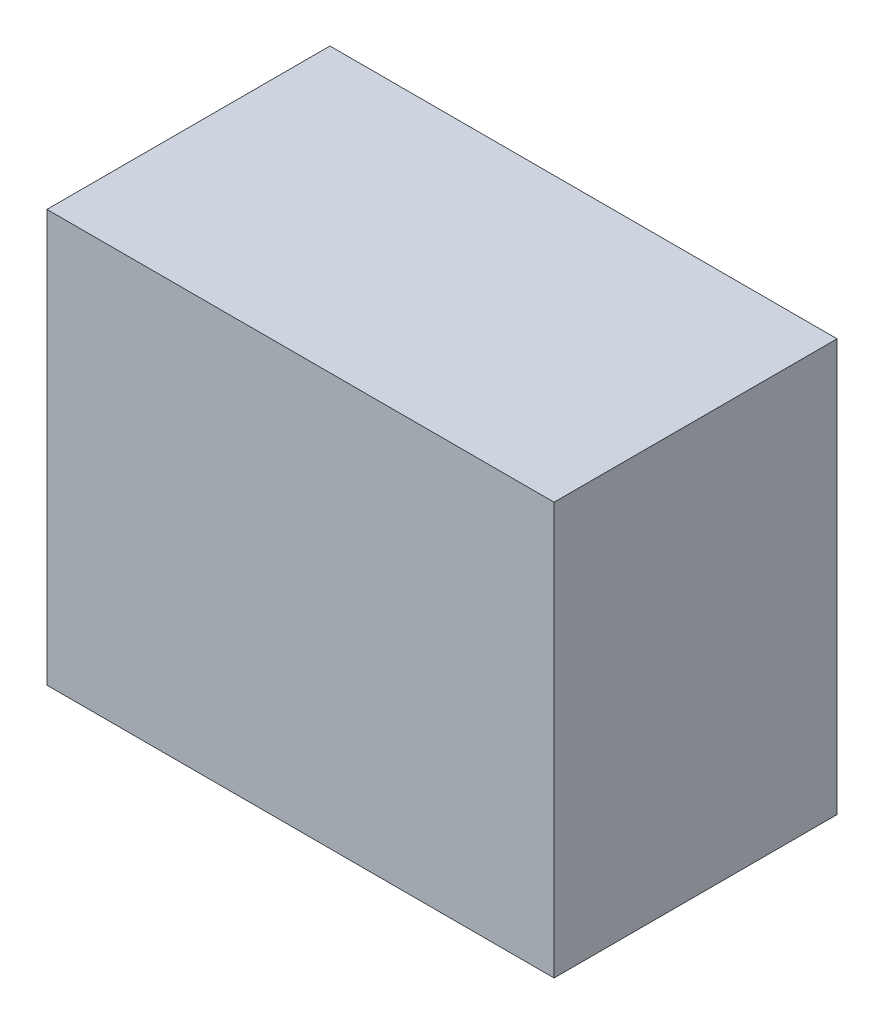
ISO-10303-21;
HEADER;
FILE_DESCRIPTION(('STEP AP214'),'2;1');
FILE_NAME('part.step','',(''),(''),'','','');
FILE_SCHEMA(('AUTOMOTIVE_DESIGN { 1 0 10303 214 1 1 1 1 }'));
ENDSEC;
DATA;
#1=APPLICATION_CONTEXT('core data for automotive mechanical design processes');
#2=APPLICATION_PROTOCOL_DEFINITION('international standard','automotive_design',2000,#1);
#3=PRODUCT_CONTEXT('',#1,'mechanical');
#4=PRODUCT('Part','Part','',(#3));
#5=PRODUCT_RELATED_PRODUCT_CATEGORY('part','',(#4));
#6=PRODUCT_DEFINITION_FORMATION('','',#4);
#7=PRODUCT_DEFINITION_CONTEXT('part definition',#1,'design');
#8=PRODUCT_DEFINITION('design','',#6,#7);
#9=PRODUCT_DEFINITION_SHAPE('','',#8);
#10=(LENGTH_UNIT() NAMED_UNIT(*) SI_UNIT(.MILLI.,.METRE.));
#11=(NAMED_UNIT(*) PLANE_ANGLE_UNIT() SI_UNIT($,.RADIAN.));
#12=(NAMED_UNIT(*) SI_UNIT($,.STERADIAN.) SOLID_ANGLE_UNIT());
#13=UNCERTAINTY_MEASURE_WITH_UNIT(LENGTH_MEASURE(1.E-05),#10,'distance_accuracy_value','');
#14=(GEOMETRIC_REPRESENTATION_CONTEXT(3) GLOBAL_UNCERTAINTY_ASSIGNED_CONTEXT((#13)) GLOBAL_UNIT_ASSIGNED_CONTEXT((#10,
#11,#12)) REPRESENTATION_CONTEXT('',''));
#15=CARTESIAN_POINT('',(0.,0.,0.));
#16=DIRECTION('',(0.,0.,1.));
#17=DIRECTION('',(1.,0.,0.));
#18=AXIS2_PLACEMENT_3D('',#15,#16,#17);
#19=CARTESIAN_POINT('',(-11.2,18.2,6.25));
#20=DIRECTION('',(1.,0.,0.));
#21=DIRECTION('',(0.,0.,-1.));
#22=AXIS2_PLACEMENT_3D('',#19,#20,#21);
#23=PLANE('',#22);
#24=DIRECTION('',(0.,0.,1.));
#25=VECTOR('',#24,1.);
#26=CARTESIAN_POINT('',(-11.2,0.,6.25));
#27=LINE('',#26,#25);
#28=CARTESIAN_POINT('',(-11.2,0.,-6.25));
#29=VERTEX_POINT('',#28);
#30=CARTESIAN_POINT('',(-11.2,0.,6.25));
#31=VERTEX_POINT('',#30);
#32=EDGE_CURVE('E96',#29,#31,#27,.T.);
#33=ORIENTED_EDGE('',*,*,#32,.T.);
#34=DIRECTION('',(0.,-1.,0.));
#35=VECTOR('',#34,1.);
#36=CARTESIAN_POINT('',(-11.2,18.2,6.25));
#37=LINE('',#36,#35);
#38=CARTESIAN_POINT('',(-11.2,18.2,6.25));
#39=VERTEX_POINT('',#38);
#40=EDGE_CURVE('E11',#39,#31,#37,.T.);
#41=ORIENTED_EDGE('',*,*,#40,.F.);
#42=DIRECTION('',(0.,0.,1.));
#43=VECTOR('',#42,1.);
#44=CARTESIAN_POINT('',(-11.2,18.2,6.25));
#45=LINE('',#44,#43);
#46=CARTESIAN_POINT('',(-11.2,18.2,-6.25));
#47=VERTEX_POINT('',#46);
#48=EDGE_CURVE('E84',#47,#39,#45,.T.);
#49=ORIENTED_EDGE('',*,*,#48,.F.);
#50=DIRECTION('',(0.,-1.,0.));
#51=VECTOR('',#50,1.);
#52=CARTESIAN_POINT('',(-11.2,18.2,-6.25));
#53=LINE('',#52,#51);
#54=EDGE_CURVE('E92',#47,#29,#53,.T.);
#55=ORIENTED_EDGE('',*,*,#54,.T.);
#56=EDGE_LOOP('',(#33,#41,#49,#55));
#57=FACE_BOUND('',#56,.T.);
#58=ADVANCED_FACE('F33',(#57),#23,.F.);
#59=CARTESIAN_POINT('',(11.2,18.2,6.25));
#60=DIRECTION('',(0.,0.,-1.));
#61=DIRECTION('',(-1.,0.,0.));
#62=AXIS2_PLACEMENT_3D('',#59,#60,#61);
#63=PLANE('',#62);
#64=DIRECTION('',(1.,0.,0.));
#65=VECTOR('',#64,1.);
#66=CARTESIAN_POINT('',(11.2,0.,6.25));
#67=LINE('',#66,#65);
#68=CARTESIAN_POINT('',(11.2,0.,6.25));
#69=VERTEX_POINT('',#68);
#70=EDGE_CURVE('E88',#31,#69,#67,.T.);
#71=ORIENTED_EDGE('',*,*,#70,.T.);
#72=DIRECTION('',(0.,-1.,0.));
#73=VECTOR('',#72,1.);
#74=CARTESIAN_POINT('',(11.2,18.2,6.25));
#75=LINE('',#74,#73);
#76=CARTESIAN_POINT('',(11.2,18.2,6.25));
#77=VERTEX_POINT('',#76);
#78=EDGE_CURVE('E41',#77,#69,#75,.T.);
#79=ORIENTED_EDGE('',*,*,#78,.F.);
#80=DIRECTION('',(1.,0.,0.));
#81=VECTOR('',#80,1.);
#82=CARTESIAN_POINT('',(11.2,18.2,6.25));
#83=LINE('',#82,#81);
#84=EDGE_CURVE('E79',#39,#77,#83,.T.);
#85=ORIENTED_EDGE('',*,*,#84,.F.);
#86=ORIENTED_EDGE('',*,*,#40,.T.);
#87=EDGE_LOOP('',(#71,#79,#85,#86));
#88=FACE_BOUND('',#87,.T.);
#89=ADVANCED_FACE('F87',(#88),#63,.F.);
#90=CARTESIAN_POINT('',(11.2,18.2,6.25));
#91=DIRECTION('',(-1.,0.,0.));
#92=DIRECTION('',(0.,0.,1.));
#93=AXIS2_PLACEMENT_3D('',#90,#91,#92);
#94=PLANE('',#93);
#95=DIRECTION('',(0.,0.,-1.));
#96=VECTOR('',#95,1.);
#97=CARTESIAN_POINT('',(11.2,0.,6.25));
#98=LINE('',#97,#96);
#99=CARTESIAN_POINT('',(11.2,0.,-6.25));
#100=VERTEX_POINT('',#99);
#101=EDGE_CURVE('E66',#69,#100,#98,.T.);
#102=ORIENTED_EDGE('',*,*,#101,.T.);
#103=DIRECTION('',(0.,-1.,0.));
#104=VECTOR('',#103,1.);
#105=CARTESIAN_POINT('',(11.2,18.2,-6.25));
#106=LINE('',#105,#104);
#107=CARTESIAN_POINT('',(11.2,18.2,-6.25));
#108=VERTEX_POINT('',#107);
#109=EDGE_CURVE('E89',#108,#100,#106,.T.);
#110=ORIENTED_EDGE('',*,*,#109,.F.);
#111=DIRECTION('',(0.,0.,-1.));
#112=VECTOR('',#111,1.);
#113=CARTESIAN_POINT('',(11.2,18.2,6.25));
#114=LINE('',#113,#112);
#115=EDGE_CURVE('E82',#77,#108,#114,.T.);
#116=ORIENTED_EDGE('',*,*,#115,.F.);
#117=ORIENTED_EDGE('',*,*,#78,.T.);
#118=EDGE_LOOP('',(#102,#110,#116,#117));
#119=FACE_BOUND('',#118,.T.);
#120=ADVANCED_FACE('F90',(#119),#94,.F.);
#121=CARTESIAN_POINT('',(11.2,18.2,-6.25));
#122=DIRECTION('',(0.,0.,1.));
#123=DIRECTION('',(1.,0.,0.));
#124=AXIS2_PLACEMENT_3D('',#121,#122,#123);
#125=PLANE('',#124);
#126=DIRECTION('',(-1.,0.,0.));
#127=VECTOR('',#126,1.);
#128=CARTESIAN_POINT('',(11.2,0.,-6.25));
#129=LINE('',#128,#127);
#130=EDGE_CURVE('E72',#100,#29,#129,.T.);
#131=ORIENTED_EDGE('',*,*,#130,.T.);
#132=ORIENTED_EDGE('',*,*,#54,.F.);
#133=DIRECTION('',(-1.,0.,0.));
#134=VECTOR('',#133,1.);
#135=CARTESIAN_POINT('',(11.2,18.2,-6.25));
#136=LINE('',#135,#134);
#137=EDGE_CURVE('E49',#108,#47,#136,.T.);
#138=ORIENTED_EDGE('',*,*,#137,.F.);
#139=ORIENTED_EDGE('',*,*,#109,.T.);
#140=EDGE_LOOP('',(#131,#132,#138,#139));
#141=FACE_BOUND('',#140,.T.);
#142=ADVANCED_FACE('F103',(#141),#125,.F.);
#143=CARTESIAN_POINT('',(0.,18.2,0.));
#144=DIRECTION('',(0.,1.,0.));
#145=DIRECTION('',(0.,0.,1.));
#146=AXIS2_PLACEMENT_3D('',#143,#144,#145);
#147=PLANE('',#146);
#148=ORIENTED_EDGE('',*,*,#48,.T.);
#149=ORIENTED_EDGE('',*,*,#84,.T.);
#150=ORIENTED_EDGE('',*,*,#115,.T.);
#151=ORIENTED_EDGE('',*,*,#137,.T.);
#152=EDGE_LOOP('',(#148,#149,#150,#151));
#153=FACE_BOUND('',#152,.T.);
#154=ADVANCED_FACE('F80',(#153),#147,.T.);
#155=CARTESIAN_POINT('',(0.,0.,0.));
#156=DIRECTION('',(0.,1.,0.));
#157=DIRECTION('',(0.,0.,1.));
#158=AXIS2_PLACEMENT_3D('',#155,#156,#157);
#159=PLANE('',#158);
#160=ORIENTED_EDGE('',*,*,#32,.F.);
#161=ORIENTED_EDGE('',*,*,#130,.F.);
#162=ORIENTED_EDGE('',*,*,#101,.F.);
#163=ORIENTED_EDGE('',*,*,#70,.F.);
#164=EDGE_LOOP('',(#160,#161,#162,#163));
#165=FACE_BOUND('',#164,.T.);
#166=ADVANCED_FACE('F106',(#165),#159,.F.);
#167=CLOSED_SHELL('',(#58,#89,#120,#142,#154,#166));
#168=MANIFOLD_SOLID_BREP('B2',#167);
#169=ADVANCED_BREP_SHAPE_REPRESENTATION('',(#18,#168),#14);
#170=SHAPE_DEFINITION_REPRESENTATION(#9,#169);
ENDSEC;
END-ISO-10303-21;
